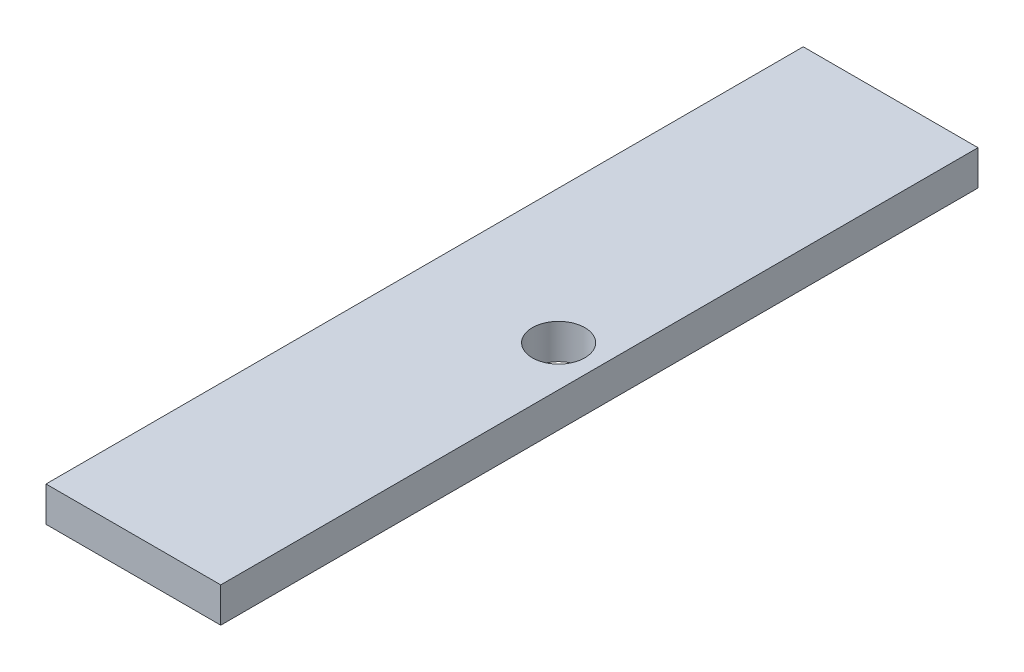
ISO-10303-21;
HEADER;
FILE_DESCRIPTION(('STEP AP214'),'2;1');
FILE_NAME('part.step','',(''),(''),'','','');
FILE_SCHEMA(('AUTOMOTIVE_DESIGN { 1 0 10303 214 1 1 1 1 }'));
ENDSEC;
DATA;
#1=APPLICATION_CONTEXT('core data for automotive mechanical design processes');
#2=APPLICATION_PROTOCOL_DEFINITION('international standard','automotive_design',2000,#1);
#3=PRODUCT_CONTEXT('',#1,'mechanical');
#4=PRODUCT('Part','Part','',(#3));
#5=PRODUCT_RELATED_PRODUCT_CATEGORY('part','',(#4));
#6=PRODUCT_DEFINITION_FORMATION('','',#4);
#7=PRODUCT_DEFINITION_CONTEXT('part definition',#1,'design');
#8=PRODUCT_DEFINITION('design','',#6,#7);
#9=PRODUCT_DEFINITION_SHAPE('','',#8);
#10=(LENGTH_UNIT() NAMED_UNIT(*) SI_UNIT(.MILLI.,.METRE.));
#11=(NAMED_UNIT(*) PLANE_ANGLE_UNIT() SI_UNIT($,.RADIAN.));
#12=(NAMED_UNIT(*) SI_UNIT($,.STERADIAN.) SOLID_ANGLE_UNIT());
#13=UNCERTAINTY_MEASURE_WITH_UNIT(LENGTH_MEASURE(1.E-05),#10,'distance_accuracy_value','');
#14=(GEOMETRIC_REPRESENTATION_CONTEXT(3) GLOBAL_UNCERTAINTY_ASSIGNED_CONTEXT((#13)) GLOBAL_UNIT_ASSIGNED_CONTEXT((#10,
#11,#12)) REPRESENTATION_CONTEXT('',''));
#15=CARTESIAN_POINT('',(0.,0.,0.));
#16=DIRECTION('',(0.,0.,1.));
#17=DIRECTION('',(1.,0.,0.));
#18=AXIS2_PLACEMENT_3D('',#15,#16,#17);
#19=CARTESIAN_POINT('',(-15.,3.,65.));
#20=DIRECTION('',(1.,0.,0.));
#21=DIRECTION('',(0.,0.,-1.));
#22=AXIS2_PLACEMENT_3D('',#19,#20,#21);
#23=PLANE('',#22);
#24=DIRECTION('',(0.,-1.,0.));
#25=VECTOR('',#24,1.);
#26=CARTESIAN_POINT('',(-15.,3.,-65.));
#27=LINE('',#26,#25);
#28=CARTESIAN_POINT('',(-15.,3.,-65.));
#29=VERTEX_POINT('',#28);
#30=CARTESIAN_POINT('',(-15.,-3.,-65.));
#31=VERTEX_POINT('',#30);
#32=EDGE_CURVE('E102',#29,#31,#27,.T.);
#33=ORIENTED_EDGE('',*,*,#32,.T.);
#34=DIRECTION('',(0.,0.,-1.));
#35=VECTOR('',#34,1.);
#36=CARTESIAN_POINT('',(-15.,-3.,65.));
#37=LINE('',#36,#35);
#38=CARTESIAN_POINT('',(-15.,-3.,65.));
#39=VERTEX_POINT('',#38);
#40=EDGE_CURVE('E11',#39,#31,#37,.T.);
#41=ORIENTED_EDGE('',*,*,#40,.F.);
#42=DIRECTION('',(0.,-1.,0.));
#43=VECTOR('',#42,1.);
#44=CARTESIAN_POINT('',(-15.,3.,65.));
#45=LINE('',#44,#43);
#46=CARTESIAN_POINT('',(-15.,3.,65.));
#47=VERTEX_POINT('',#46);
#48=EDGE_CURVE('E89',#47,#39,#45,.T.);
#49=ORIENTED_EDGE('',*,*,#48,.F.);
#50=DIRECTION('',(0.,0.,-1.));
#51=VECTOR('',#50,1.);
#52=CARTESIAN_POINT('',(-15.,3.,65.));
#53=LINE('',#52,#51);
#54=EDGE_CURVE('E98',#47,#29,#53,.T.);
#55=ORIENTED_EDGE('',*,*,#54,.T.);
#56=EDGE_LOOP('',(#33,#41,#49,#55));
#57=FACE_BOUND('',#56,.T.);
#58=ADVANCED_FACE('F37',(#57),#23,.F.);
#59=CARTESIAN_POINT('',(-15.,-3.,65.));
#60=DIRECTION('',(0.,1.,0.));
#61=DIRECTION('',(0.,0.,1.));
#62=AXIS2_PLACEMENT_3D('',#59,#60,#61);
#63=PLANE('',#62);
#64=CARTESIAN_POINT('',(7.99999999999998,-3.,0.));
#65=DIRECTION('',(0.,1.,0.));
#66=DIRECTION('',(0.,0.,1.));
#67=AXIS2_PLACEMENT_3D('',#64,#65,#66);
#68=CIRCLE('',#67,4.5);
#69=CARTESIAN_POINT('',(7.99999999999998,-3.,4.5));
#70=VERTEX_POINT('',#69);
#71=EDGE_CURVE('E105',#70,#70,#68,.T.);
#72=ORIENTED_EDGE('',*,*,#71,.T.);
#73=EDGE_LOOP('',(#72));
#74=FACE_BOUND('',#73,.T.);
#75=DIRECTION('',(1.,0.,0.));
#76=VECTOR('',#75,1.);
#77=CARTESIAN_POINT('',(-15.,-3.,-65.));
#78=LINE('',#77,#76);
#79=CARTESIAN_POINT('',(15.,-3.,-65.));
#80=VERTEX_POINT('',#79);
#81=EDGE_CURVE('E93',#31,#80,#78,.T.);
#82=ORIENTED_EDGE('',*,*,#81,.T.);
#83=DIRECTION('',(0.,0.,-1.));
#84=VECTOR('',#83,1.);
#85=CARTESIAN_POINT('',(15.,-3.,65.));
#86=LINE('',#85,#84);
#87=CARTESIAN_POINT('',(15.,-3.,65.));
#88=VERTEX_POINT('',#87);
#89=EDGE_CURVE('E46',#88,#80,#86,.T.);
#90=ORIENTED_EDGE('',*,*,#89,.F.);
#91=DIRECTION('',(1.,0.,0.));
#92=VECTOR('',#91,1.);
#93=CARTESIAN_POINT('',(-15.,-3.,65.));
#94=LINE('',#93,#92);
#95=EDGE_CURVE('E84',#39,#88,#94,.T.);
#96=ORIENTED_EDGE('',*,*,#95,.F.);
#97=ORIENTED_EDGE('',*,*,#40,.T.);
#98=EDGE_LOOP('',(#82,#90,#96,#97));
#99=FACE_BOUND('',#98,.T.);
#100=ADVANCED_FACE('F92',(#74,#99),#63,.F.);
#101=CARTESIAN_POINT('',(15.,3.,65.));
#102=DIRECTION('',(-1.,0.,0.));
#103=DIRECTION('',(0.,0.,1.));
#104=AXIS2_PLACEMENT_3D('',#101,#102,#103);
#105=PLANE('',#104);
#106=DIRECTION('',(0.,1.,0.));
#107=VECTOR('',#106,1.);
#108=CARTESIAN_POINT('',(15.,3.,-65.));
#109=LINE('',#108,#107);
#110=CARTESIAN_POINT('',(15.,3.,-65.));
#111=VERTEX_POINT('',#110);
#112=EDGE_CURVE('E71',#80,#111,#109,.T.);
#113=ORIENTED_EDGE('',*,*,#112,.T.);
#114=DIRECTION('',(0.,0.,-1.));
#115=VECTOR('',#114,1.);
#116=CARTESIAN_POINT('',(15.,3.,65.));
#117=LINE('',#116,#115);
#118=CARTESIAN_POINT('',(15.,3.,65.));
#119=VERTEX_POINT('',#118);
#120=EDGE_CURVE('E95',#119,#111,#117,.T.);
#121=ORIENTED_EDGE('',*,*,#120,.F.);
#122=DIRECTION('',(0.,1.,0.));
#123=VECTOR('',#122,1.);
#124=CARTESIAN_POINT('',(15.,3.,65.));
#125=LINE('',#124,#123);
#126=EDGE_CURVE('E87',#88,#119,#125,.T.);
#127=ORIENTED_EDGE('',*,*,#126,.F.);
#128=ORIENTED_EDGE('',*,*,#89,.T.);
#129=EDGE_LOOP('',(#113,#121,#127,#128));
#130=FACE_BOUND('',#129,.T.);
#131=ADVANCED_FACE('F96',(#130),#105,.F.);
#132=CARTESIAN_POINT('',(-15.,3.,65.));
#133=DIRECTION('',(0.,-1.,0.));
#134=DIRECTION('',(0.,0.,-1.));
#135=AXIS2_PLACEMENT_3D('',#132,#133,#134);
#136=PLANE('',#135);
#137=CARTESIAN_POINT('',(7.99999999999998,3.,0.));
#138=DIRECTION('',(0.,1.,0.));
#139=DIRECTION('',(0.,0.,1.));
#140=AXIS2_PLACEMENT_3D('',#137,#138,#139);
#141=CIRCLE('',#140,4.5);
#142=CARTESIAN_POINT('',(7.99999999999998,3.,4.5));
#143=VERTEX_POINT('',#142);
#144=EDGE_CURVE('E121',#143,#143,#141,.T.);
#145=ORIENTED_EDGE('',*,*,#144,.F.);
#146=EDGE_LOOP('',(#145));
#147=FACE_BOUND('',#146,.T.);
#148=DIRECTION('',(-1.,0.,0.));
#149=VECTOR('',#148,1.);
#150=CARTESIAN_POINT('',(-15.,3.,-65.));
#151=LINE('',#150,#149);
#152=EDGE_CURVE('E77',#111,#29,#151,.T.);
#153=ORIENTED_EDGE('',*,*,#152,.T.);
#154=ORIENTED_EDGE('',*,*,#54,.F.);
#155=DIRECTION('',(-1.,0.,0.));
#156=VECTOR('',#155,1.);
#157=CARTESIAN_POINT('',(-15.,3.,65.));
#158=LINE('',#157,#156);
#159=EDGE_CURVE('E54',#119,#47,#158,.T.);
#160=ORIENTED_EDGE('',*,*,#159,.F.);
#161=ORIENTED_EDGE('',*,*,#120,.T.);
#162=EDGE_LOOP('',(#153,#154,#160,#161));
#163=FACE_BOUND('',#162,.T.);
#164=ADVANCED_FACE('F112',(#147,#163),#136,.F.);
#165=CARTESIAN_POINT('',(0.,0.,65.));
#166=DIRECTION('',(0.,0.,1.));
#167=DIRECTION('',(1.,0.,0.));
#168=AXIS2_PLACEMENT_3D('',#165,#166,#167);
#169=PLANE('',#168);
#170=ORIENTED_EDGE('',*,*,#48,.T.);
#171=ORIENTED_EDGE('',*,*,#95,.T.);
#172=ORIENTED_EDGE('',*,*,#126,.T.);
#173=ORIENTED_EDGE('',*,*,#159,.T.);
#174=EDGE_LOOP('',(#170,#171,#172,#173));
#175=FACE_BOUND('',#174,.T.);
#176=ADVANCED_FACE('F85',(#175),#169,.T.);
#177=CARTESIAN_POINT('',(0.,0.,-65.));
#178=DIRECTION('',(0.,0.,1.));
#179=DIRECTION('',(1.,0.,0.));
#180=AXIS2_PLACEMENT_3D('',#177,#178,#179);
#181=PLANE('',#180);
#182=ORIENTED_EDGE('',*,*,#32,.F.);
#183=ORIENTED_EDGE('',*,*,#152,.F.);
#184=ORIENTED_EDGE('',*,*,#112,.F.);
#185=ORIENTED_EDGE('',*,*,#81,.F.);
#186=EDGE_LOOP('',(#182,#183,#184,#185));
#187=FACE_BOUND('',#186,.T.);
#188=ADVANCED_FACE('F115',(#187),#181,.F.);
#189=CARTESIAN_POINT('',(7.99999999999998,-3.,0.));
#190=DIRECTION('',(0.,1.,0.));
#191=DIRECTION('',(0.,0.,1.));
#192=AXIS2_PLACEMENT_3D('',#189,#190,#191);
#193=CYLINDRICAL_SURFACE('',#192,4.5);
#194=ORIENTED_EDGE('',*,*,#71,.F.);
#195=EDGE_LOOP('',(#194));
#196=FACE_BOUND('',#195,.T.);
#197=ORIENTED_EDGE('',*,*,#144,.T.);
#198=EDGE_LOOP('',(#197));
#199=FACE_BOUND('',#198,.T.);
#200=ADVANCED_FACE('F126',(#196,#199),#193,.F.);
#201=CLOSED_SHELL('',(#58,#100,#131,#164,#176,#188,#200));
#202=MANIFOLD_SOLID_BREP('B2',#201);
#203=ADVANCED_BREP_SHAPE_REPRESENTATION('',(#18,#202),#14);
#204=SHAPE_DEFINITION_REPRESENTATION(#9,#203);
ENDSEC;
END-ISO-10303-21;
